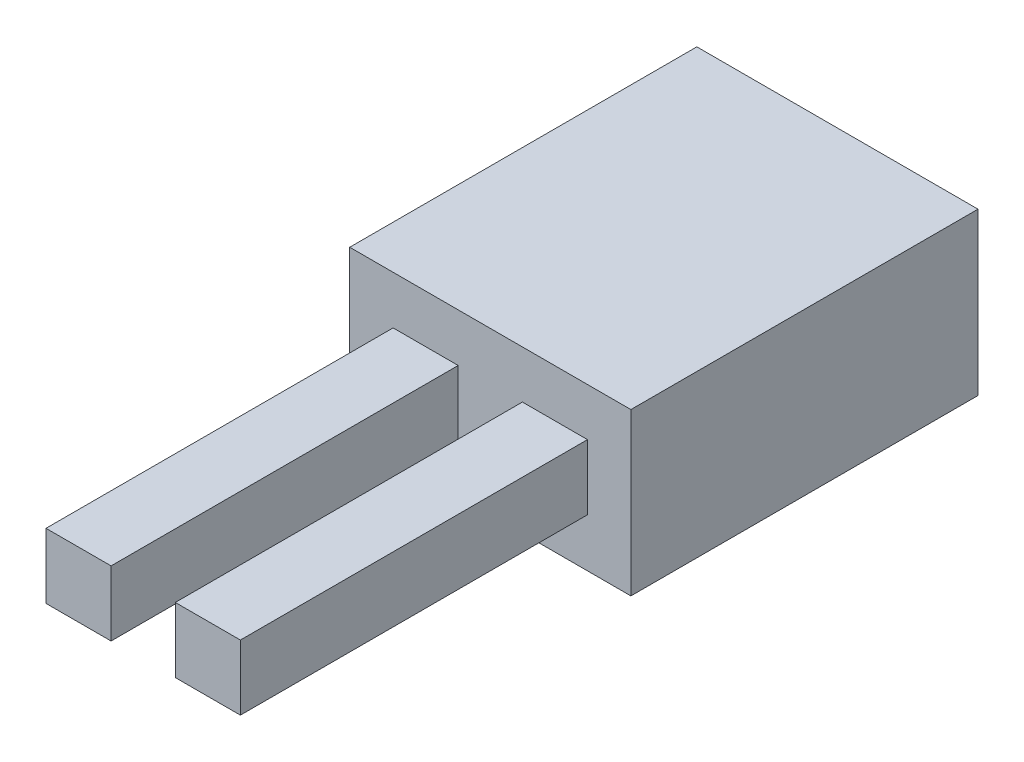
ISO-10303-21;
HEADER;
FILE_DESCRIPTION(('STEP AP214'),'2;1');
FILE_NAME('part.step','',(''),(''),'','','');
FILE_SCHEMA(('AUTOMOTIVE_DESIGN { 1 0 10303 214 1 1 1 1 }'));
ENDSEC;
DATA;
#1=APPLICATION_CONTEXT('core data for automotive mechanical design processes');
#2=APPLICATION_PROTOCOL_DEFINITION('international standard','automotive_design',2000,#1);
#3=PRODUCT_CONTEXT('',#1,'mechanical');
#4=PRODUCT('Part','Part','',(#3));
#5=PRODUCT_RELATED_PRODUCT_CATEGORY('part','',(#4));
#6=PRODUCT_DEFINITION_FORMATION('','',#4);
#7=PRODUCT_DEFINITION_CONTEXT('part definition',#1,'design');
#8=PRODUCT_DEFINITION('design','',#6,#7);
#9=PRODUCT_DEFINITION_SHAPE('','',#8);
#10=(LENGTH_UNIT() NAMED_UNIT(*) SI_UNIT(.MILLI.,.METRE.));
#11=(NAMED_UNIT(*) PLANE_ANGLE_UNIT() SI_UNIT($,.RADIAN.));
#12=(NAMED_UNIT(*) SI_UNIT($,.STERADIAN.) SOLID_ANGLE_UNIT());
#13=UNCERTAINTY_MEASURE_WITH_UNIT(LENGTH_MEASURE(1.E-05),#10,'distance_accuracy_value','');
#14=(GEOMETRIC_REPRESENTATION_CONTEXT(3) GLOBAL_UNCERTAINTY_ASSIGNED_CONTEXT((#13)) GLOBAL_UNIT_ASSIGNED_CONTEXT((#10,
#11,#12)) REPRESENTATION_CONTEXT('',''));
#15=CARTESIAN_POINT('',(0.,0.,0.));
#16=DIRECTION('',(0.,0.,1.));
#17=DIRECTION('',(1.,0.,0.));
#18=AXIS2_PLACEMENT_3D('',#15,#16,#17);
#19=CARTESIAN_POINT('',(0.,1.86,0.));
#20=DIRECTION('',(0.,0.,-1.));
#21=DIRECTION('',(-1.,0.,0.));
#22=AXIS2_PLACEMENT_3D('',#19,#20,#21);
#23=PLANE('',#22);
#24=DIRECTION('',(0.,-1.,0.));
#25=VECTOR('',#24,1.);
#26=CARTESIAN_POINT('',(0.5,1.305,0.));
#27=LINE('',#26,#25);
#28=CARTESIAN_POINT('',(0.5,1.305,0.));
#29=VERTEX_POINT('',#28);
#30=CARTESIAN_POINT('',(0.5,0.555,0.));
#31=VERTEX_POINT('',#30);
#32=EDGE_CURVE('E143',#29,#31,#27,.T.);
#33=ORIENTED_EDGE('',*,*,#32,.F.);
#34=DIRECTION('',(-1.,0.,0.));
#35=VECTOR('',#34,1.);
#36=CARTESIAN_POINT('',(0.5,1.305,0.));
#37=LINE('',#36,#35);
#38=CARTESIAN_POINT('',(1.25,1.305,0.));
#39=VERTEX_POINT('',#38);
#40=EDGE_CURVE('E156',#39,#29,#37,.T.);
#41=ORIENTED_EDGE('',*,*,#40,.F.);
#42=DIRECTION('',(0.,1.,0.));
#43=VECTOR('',#42,1.);
#44=CARTESIAN_POINT('',(1.25,1.305,0.));
#45=LINE('',#44,#43);
#46=CARTESIAN_POINT('',(1.25,0.555,0.));
#47=VERTEX_POINT('',#46);
#48=EDGE_CURVE('E165',#47,#39,#45,.T.);
#49=ORIENTED_EDGE('',*,*,#48,.F.);
#50=DIRECTION('',(1.,0.,0.));
#51=VECTOR('',#50,1.);
#52=CARTESIAN_POINT('',(0.5,0.555,0.));
#53=LINE('',#52,#51);
#54=EDGE_CURVE('E146',#31,#47,#53,.T.);
#55=ORIENTED_EDGE('',*,*,#54,.F.);
#56=EDGE_LOOP('',(#33,#41,#49,#55));
#57=FACE_BOUND('',#56,.T.);
#58=DIRECTION('',(1.,0.,0.));
#59=VECTOR('',#58,1.);
#60=CARTESIAN_POINT('',(0.,0.,0.));
#61=LINE('',#60,#59);
#62=CARTESIAN_POINT('',(0.,0.,0.));
#63=VERTEX_POINT('',#62);
#64=CARTESIAN_POINT('',(3.24,0.,0.));
#65=VERTEX_POINT('',#64);
#66=EDGE_CURVE('E195',#63,#65,#61,.T.);
#67=ORIENTED_EDGE('',*,*,#66,.T.);
#68=DIRECTION('',(0.,-1.,0.));
#69=VECTOR('',#68,1.);
#70=CARTESIAN_POINT('',(3.24,1.86,0.));
#71=LINE('',#70,#69);
#72=CARTESIAN_POINT('',(3.24,1.86,0.));
#73=VERTEX_POINT('',#72);
#74=EDGE_CURVE('E41',#73,#65,#71,.T.);
#75=ORIENTED_EDGE('',*,*,#74,.F.);
#76=DIRECTION('',(1.,0.,0.));
#77=VECTOR('',#76,1.);
#78=CARTESIAN_POINT('',(0.,1.86,0.));
#79=LINE('',#78,#77);
#80=CARTESIAN_POINT('',(0.,1.86,0.));
#81=VERTEX_POINT('',#80);
#82=EDGE_CURVE('E185',#81,#73,#79,.T.);
#83=ORIENTED_EDGE('',*,*,#82,.F.);
#84=DIRECTION('',(0.,-1.,0.));
#85=VECTOR('',#84,1.);
#86=CARTESIAN_POINT('',(0.,1.86,0.));
#87=LINE('',#86,#85);
#88=EDGE_CURVE('E11',#81,#63,#87,.T.);
#89=ORIENTED_EDGE('',*,*,#88,.T.);
#90=EDGE_LOOP('',(#67,#75,#83,#89));
#91=FACE_BOUND('',#90,.T.);
#92=DIRECTION('',(0.,-1.,0.));
#93=VECTOR('',#92,1.);
#94=CARTESIAN_POINT('',(1.99,1.31,0.));
#95=LINE('',#94,#93);
#96=CARTESIAN_POINT('',(1.99,1.31,0.));
#97=VERTEX_POINT('',#96);
#98=CARTESIAN_POINT('',(1.99,0.56,0.));
#99=VERTEX_POINT('',#98);
#100=EDGE_CURVE('E142',#97,#99,#95,.T.);
#101=ORIENTED_EDGE('',*,*,#100,.F.);
#102=DIRECTION('',(-1.,0.,0.));
#103=VECTOR('',#102,1.);
#104=CARTESIAN_POINT('',(1.99,1.31,0.));
#105=LINE('',#104,#103);
#106=CARTESIAN_POINT('',(2.74,1.31,0.));
#107=VERTEX_POINT('',#106);
#108=EDGE_CURVE('E139',#107,#97,#105,.T.);
#109=ORIENTED_EDGE('',*,*,#108,.F.);
#110=DIRECTION('',(0.,1.,0.));
#111=VECTOR('',#110,1.);
#112=CARTESIAN_POINT('',(2.74,1.31,0.));
#113=LINE('',#112,#111);
#114=CARTESIAN_POINT('',(2.74,0.56,0.));
#115=VERTEX_POINT('',#114);
#116=EDGE_CURVE('E53',#115,#107,#113,.T.);
#117=ORIENTED_EDGE('',*,*,#116,.F.);
#118=DIRECTION('',(1.,0.,0.));
#119=VECTOR('',#118,1.);
#120=CARTESIAN_POINT('',(1.99,0.56,0.));
#121=LINE('',#120,#119);
#122=EDGE_CURVE('E48',#99,#115,#121,.T.);
#123=ORIENTED_EDGE('',*,*,#122,.F.);
#124=EDGE_LOOP('',(#101,#109,#117,#123));
#125=FACE_BOUND('',#124,.T.);
#126=ADVANCED_FACE('F33',(#57,#91,#125),#23,.F.);
#127=CARTESIAN_POINT('',(0.,1.86,0.));
#128=DIRECTION('',(1.,0.,0.));
#129=DIRECTION('',(0.,0.,-1.));
#130=AXIS2_PLACEMENT_3D('',#127,#128,#129);
#131=PLANE('',#130);
#132=DIRECTION('',(0.,0.,1.));
#133=VECTOR('',#132,1.);
#134=CARTESIAN_POINT('',(0.,0.,0.));
#135=LINE('',#134,#133);
#136=CARTESIAN_POINT('',(0.,0.,-4.));
#137=VERTEX_POINT('',#136);
#138=EDGE_CURVE('E181',#137,#63,#135,.T.);
#139=ORIENTED_EDGE('',*,*,#138,.T.);
#140=ORIENTED_EDGE('',*,*,#88,.F.);
#141=DIRECTION('',(0.,0.,1.));
#142=VECTOR('',#141,1.);
#143=CARTESIAN_POINT('',(0.,1.86,0.));
#144=LINE('',#143,#142);
#145=CARTESIAN_POINT('',(0.,1.86,-4.));
#146=VERTEX_POINT('',#145);
#147=EDGE_CURVE('E182',#146,#81,#144,.T.);
#148=ORIENTED_EDGE('',*,*,#147,.F.);
#149=DIRECTION('',(0.,-1.,0.));
#150=VECTOR('',#149,1.);
#151=CARTESIAN_POINT('',(0.,1.86,-4.));
#152=LINE('',#151,#150);
#153=EDGE_CURVE('E192',#146,#137,#152,.T.);
#154=ORIENTED_EDGE('',*,*,#153,.T.);
#155=EDGE_LOOP('',(#139,#140,#148,#154));
#156=FACE_BOUND('',#155,.T.);
#157=ADVANCED_FACE('F35',(#156),#131,.F.);
#158=CARTESIAN_POINT('',(3.24,1.86,0.));
#159=DIRECTION('',(-1.,0.,0.));
#160=DIRECTION('',(0.,0.,1.));
#161=AXIS2_PLACEMENT_3D('',#158,#159,#160);
#162=PLANE('',#161);
#163=DIRECTION('',(0.,0.,-1.));
#164=VECTOR('',#163,1.);
#165=CARTESIAN_POINT('',(3.24,0.,0.));
#166=LINE('',#165,#164);
#167=CARTESIAN_POINT('',(3.24,0.,-4.));
#168=VERTEX_POINT('',#167);
#169=EDGE_CURVE('E197',#65,#168,#166,.T.);
#170=ORIENTED_EDGE('',*,*,#169,.T.);
#171=DIRECTION('',(0.,-1.,0.));
#172=VECTOR('',#171,1.);
#173=CARTESIAN_POINT('',(3.24,1.86,-4.));
#174=LINE('',#173,#172);
#175=CARTESIAN_POINT('',(3.24,1.86,-4.));
#176=VERTEX_POINT('',#175);
#177=EDGE_CURVE('E202',#176,#168,#174,.T.);
#178=ORIENTED_EDGE('',*,*,#177,.F.);
#179=DIRECTION('',(0.,0.,-1.));
#180=VECTOR('',#179,1.);
#181=CARTESIAN_POINT('',(3.24,1.86,0.));
#182=LINE('',#181,#180);
#183=EDGE_CURVE('E188',#73,#176,#182,.T.);
#184=ORIENTED_EDGE('',*,*,#183,.F.);
#185=ORIENTED_EDGE('',*,*,#74,.T.);
#186=EDGE_LOOP('',(#170,#178,#184,#185));
#187=FACE_BOUND('',#186,.T.);
#188=ADVANCED_FACE('F209',(#187),#162,.F.);
#189=CARTESIAN_POINT('',(0.,1.86,-4.));
#190=DIRECTION('',(0.,0.,1.));
#191=DIRECTION('',(1.,0.,0.));
#192=AXIS2_PLACEMENT_3D('',#189,#190,#191);
#193=PLANE('',#192);
#194=DIRECTION('',(-1.,0.,0.));
#195=VECTOR('',#194,1.);
#196=CARTESIAN_POINT('',(0.,0.,-4.));
#197=LINE('',#196,#195);
#198=EDGE_CURVE('E186',#168,#137,#197,.T.);
#199=ORIENTED_EDGE('',*,*,#198,.T.);
#200=ORIENTED_EDGE('',*,*,#153,.F.);
#201=DIRECTION('',(-1.,0.,0.));
#202=VECTOR('',#201,1.);
#203=CARTESIAN_POINT('',(0.,1.86,-4.));
#204=LINE('',#203,#202);
#205=EDGE_CURVE('E190',#176,#146,#204,.T.);
#206=ORIENTED_EDGE('',*,*,#205,.F.);
#207=ORIENTED_EDGE('',*,*,#177,.T.);
#208=EDGE_LOOP('',(#199,#200,#206,#207));
#209=FACE_BOUND('',#208,.T.);
#210=ADVANCED_FACE('F218',(#209),#193,.F.);
#211=CARTESIAN_POINT('',(0.,1.86,0.));
#212=DIRECTION('',(0.,-1.,0.));
#213=DIRECTION('',(0.,0.,-1.));
#214=AXIS2_PLACEMENT_3D('',#211,#212,#213);
#215=PLANE('',#214);
#216=ORIENTED_EDGE('',*,*,#147,.T.);
#217=ORIENTED_EDGE('',*,*,#82,.T.);
#218=ORIENTED_EDGE('',*,*,#183,.T.);
#219=ORIENTED_EDGE('',*,*,#205,.T.);
#220=EDGE_LOOP('',(#216,#217,#218,#219));
#221=FACE_BOUND('',#220,.T.);
#222=ADVANCED_FACE('F224',(#221),#215,.F.);
#223=CARTESIAN_POINT('',(0.,0.,0.));
#224=DIRECTION('',(0.,-1.,0.));
#225=DIRECTION('',(0.,0.,-1.));
#226=AXIS2_PLACEMENT_3D('',#223,#224,#225);
#227=PLANE('',#226);
#228=ORIENTED_EDGE('',*,*,#138,.F.);
#229=ORIENTED_EDGE('',*,*,#198,.F.);
#230=ORIENTED_EDGE('',*,*,#169,.F.);
#231=ORIENTED_EDGE('',*,*,#66,.F.);
#232=EDGE_LOOP('',(#228,#229,#230,#231));
#233=FACE_BOUND('',#232,.T.);
#234=ADVANCED_FACE('F215',(#233),#227,.T.);
#235=CARTESIAN_POINT('',(0.5,1.305,4.));
#236=DIRECTION('',(1.,0.,0.));
#237=DIRECTION('',(0.,1.,0.));
#238=AXIS2_PLACEMENT_3D('',#235,#236,#237);
#239=PLANE('',#238);
#240=ORIENTED_EDGE('',*,*,#32,.T.);
#241=DIRECTION('',(0.,0.,-1.));
#242=VECTOR('',#241,1.);
#243=CARTESIAN_POINT('',(0.5,0.555,4.));
#244=LINE('',#243,#242);
#245=CARTESIAN_POINT('',(0.5,0.555,4.));
#246=VERTEX_POINT('',#245);
#247=EDGE_CURVE('E178',#246,#31,#244,.T.);
#248=ORIENTED_EDGE('',*,*,#247,.F.);
#249=DIRECTION('',(0.,-1.,0.));
#250=VECTOR('',#249,1.);
#251=CARTESIAN_POINT('',(0.5,1.305,4.));
#252=LINE('',#251,#250);
#253=CARTESIAN_POINT('',(0.5,1.305,4.));
#254=VERTEX_POINT('',#253);
#255=EDGE_CURVE('E152',#254,#246,#252,.T.);
#256=ORIENTED_EDGE('',*,*,#255,.F.);
#257=DIRECTION('',(0.,0.,-1.));
#258=VECTOR('',#257,1.);
#259=CARTESIAN_POINT('',(0.5,1.305,4.));
#260=LINE('',#259,#258);
#261=EDGE_CURVE('E161',#254,#29,#260,.T.);
#262=ORIENTED_EDGE('',*,*,#261,.T.);
#263=EDGE_LOOP('',(#240,#248,#256,#262));
#264=FACE_BOUND('',#263,.T.);
#265=ADVANCED_FACE('F269',(#264),#239,.F.);
#266=CARTESIAN_POINT('',(0.5,0.555,4.));
#267=DIRECTION('',(0.,1.,0.));
#268=DIRECTION('',(0.,0.,1.));
#269=AXIS2_PLACEMENT_3D('',#266,#267,#268);
#270=PLANE('',#269);
#271=ORIENTED_EDGE('',*,*,#54,.T.);
#272=DIRECTION('',(0.,0.,-1.));
#273=VECTOR('',#272,1.);
#274=CARTESIAN_POINT('',(1.25,0.555,4.));
#275=LINE('',#274,#273);
#276=CARTESIAN_POINT('',(1.25,0.555,4.));
#277=VERTEX_POINT('',#276);
#278=EDGE_CURVE('E175',#277,#47,#275,.T.);
#279=ORIENTED_EDGE('',*,*,#278,.F.);
#280=DIRECTION('',(1.,0.,0.));
#281=VECTOR('',#280,1.);
#282=CARTESIAN_POINT('',(0.5,0.555,4.));
#283=LINE('',#282,#281);
#284=EDGE_CURVE('E155',#246,#277,#283,.T.);
#285=ORIENTED_EDGE('',*,*,#284,.F.);
#286=ORIENTED_EDGE('',*,*,#247,.T.);
#287=EDGE_LOOP('',(#271,#279,#285,#286));
#288=FACE_BOUND('',#287,.T.);
#289=ADVANCED_FACE('F265',(#288),#270,.F.);
#290=CARTESIAN_POINT('',(1.25,1.305,4.));
#291=DIRECTION('',(-1.,0.,0.));
#292=DIRECTION('',(0.,0.,1.));
#293=AXIS2_PLACEMENT_3D('',#290,#291,#292);
#294=PLANE('',#293);
#295=ORIENTED_EDGE('',*,*,#48,.T.);
#296=DIRECTION('',(0.,0.,-1.));
#297=VECTOR('',#296,1.);
#298=CARTESIAN_POINT('',(1.25,1.305,4.));
#299=LINE('',#298,#297);
#300=CARTESIAN_POINT('',(1.25,1.305,4.));
#301=VERTEX_POINT('',#300);
#302=EDGE_CURVE('E172',#301,#39,#299,.T.);
#303=ORIENTED_EDGE('',*,*,#302,.F.);
#304=DIRECTION('',(0.,1.,0.));
#305=VECTOR('',#304,1.);
#306=CARTESIAN_POINT('',(1.25,1.305,4.));
#307=LINE('',#306,#305);
#308=EDGE_CURVE('E158',#277,#301,#307,.T.);
#309=ORIENTED_EDGE('',*,*,#308,.F.);
#310=ORIENTED_EDGE('',*,*,#278,.T.);
#311=EDGE_LOOP('',(#295,#303,#309,#310));
#312=FACE_BOUND('',#311,.T.);
#313=ADVANCED_FACE('F261',(#312),#294,.F.);
#314=CARTESIAN_POINT('',(0.5,1.305,4.));
#315=DIRECTION('',(0.,-1.,0.));
#316=DIRECTION('',(0.,0.,-1.));
#317=AXIS2_PLACEMENT_3D('',#314,#315,#316);
#318=PLANE('',#317);
#319=ORIENTED_EDGE('',*,*,#40,.T.);
#320=ORIENTED_EDGE('',*,*,#261,.F.);
#321=DIRECTION('',(-1.,0.,0.));
#322=VECTOR('',#321,1.);
#323=CARTESIAN_POINT('',(0.5,1.305,4.));
#324=LINE('',#323,#322);
#325=EDGE_CURVE('E160',#301,#254,#324,.T.);
#326=ORIENTED_EDGE('',*,*,#325,.F.);
#327=ORIENTED_EDGE('',*,*,#302,.T.);
#328=EDGE_LOOP('',(#319,#320,#326,#327));
#329=FACE_BOUND('',#328,.T.);
#330=ADVANCED_FACE('F257',(#329),#318,.F.);
#331=CARTESIAN_POINT('',(0.,0.,4.));
#332=DIRECTION('',(0.,0.,1.));
#333=DIRECTION('',(1.,0.,0.));
#334=AXIS2_PLACEMENT_3D('',#331,#332,#333);
#335=PLANE('',#334);
#336=ORIENTED_EDGE('',*,*,#255,.T.);
#337=ORIENTED_EDGE('',*,*,#284,.T.);
#338=ORIENTED_EDGE('',*,*,#308,.T.);
#339=ORIENTED_EDGE('',*,*,#325,.T.);
#340=EDGE_LOOP('',(#336,#337,#338,#339));
#341=FACE_BOUND('',#340,.T.);
#342=ADVANCED_FACE('F254',(#341),#335,.T.);
#343=CARTESIAN_POINT('',(1.99,1.31,4.));
#344=DIRECTION('',(1.,0.,0.));
#345=DIRECTION('',(0.,0.,-1.));
#346=AXIS2_PLACEMENT_3D('',#343,#344,#345);
#347=PLANE('',#346);
#348=ORIENTED_EDGE('',*,*,#100,.T.);
#349=DIRECTION('',(0.,0.,-1.));
#350=VECTOR('',#349,1.);
#351=CARTESIAN_POINT('',(1.99,0.56,4.));
#352=LINE('',#351,#350);
#353=CARTESIAN_POINT('',(1.99,0.56,4.));
#354=VERTEX_POINT('',#353);
#355=EDGE_CURVE('E123',#354,#99,#352,.T.);
#356=ORIENTED_EDGE('',*,*,#355,.F.);
#357=DIRECTION('',(0.,-1.,0.));
#358=VECTOR('',#357,1.);
#359=CARTESIAN_POINT('',(1.99,1.31,4.));
#360=LINE('',#359,#358);
#361=CARTESIAN_POINT('',(1.99,1.31,4.));
#362=VERTEX_POINT('',#361);
#363=EDGE_CURVE('E130',#362,#354,#360,.T.);
#364=ORIENTED_EDGE('',*,*,#363,.F.);
#365=DIRECTION('',(0.,0.,-1.));
#366=VECTOR('',#365,1.);
#367=CARTESIAN_POINT('',(1.99,1.31,4.));
#368=LINE('',#367,#366);
#369=EDGE_CURVE('E232',#362,#97,#368,.T.);
#370=ORIENTED_EDGE('',*,*,#369,.T.);
#371=EDGE_LOOP('',(#348,#356,#364,#370));
#372=FACE_BOUND('',#371,.T.);
#373=ADVANCED_FACE('F141',(#372),#347,.F.);
#374=CARTESIAN_POINT('',(1.99,0.56,4.));
#375=DIRECTION('',(0.,1.,0.));
#376=DIRECTION('',(0.,0.,1.));
#377=AXIS2_PLACEMENT_3D('',#374,#375,#376);
#378=PLANE('',#377);
#379=ORIENTED_EDGE('',*,*,#122,.T.);
#380=DIRECTION('',(0.,0.,-1.));
#381=VECTOR('',#380,1.);
#382=CARTESIAN_POINT('',(2.74,0.56,4.));
#383=LINE('',#382,#381);
#384=CARTESIAN_POINT('',(2.74,0.56,4.));
#385=VERTEX_POINT('',#384);
#386=EDGE_CURVE('E126',#385,#115,#383,.T.);
#387=ORIENTED_EDGE('',*,*,#386,.F.);
#388=DIRECTION('',(1.,0.,0.));
#389=VECTOR('',#388,1.);
#390=CARTESIAN_POINT('',(1.99,0.56,4.));
#391=LINE('',#390,#389);
#392=EDGE_CURVE('E119',#354,#385,#391,.T.);
#393=ORIENTED_EDGE('',*,*,#392,.F.);
#394=ORIENTED_EDGE('',*,*,#355,.T.);
#395=EDGE_LOOP('',(#379,#387,#393,#394));
#396=FACE_BOUND('',#395,.T.);
#397=ADVANCED_FACE('F121',(#396),#378,.F.);
#398=CARTESIAN_POINT('',(2.74,1.31,4.));
#399=DIRECTION('',(-1.,0.,0.));
#400=DIRECTION('',(0.,0.,1.));
#401=AXIS2_PLACEMENT_3D('',#398,#399,#400);
#402=PLANE('',#401);
#403=ORIENTED_EDGE('',*,*,#116,.T.);
#404=DIRECTION('',(0.,0.,-1.));
#405=VECTOR('',#404,1.);
#406=CARTESIAN_POINT('',(2.74,1.31,4.));
#407=LINE('',#406,#405);
#408=CARTESIAN_POINT('',(2.74,1.31,4.));
#409=VERTEX_POINT('',#408);
#410=EDGE_CURVE('E148',#409,#107,#407,.T.);
#411=ORIENTED_EDGE('',*,*,#410,.F.);
#412=DIRECTION('',(0.,1.,0.));
#413=VECTOR('',#412,1.);
#414=CARTESIAN_POINT('',(2.74,1.31,4.));
#415=LINE('',#414,#413);
#416=EDGE_CURVE('E129',#385,#409,#415,.T.);
#417=ORIENTED_EDGE('',*,*,#416,.F.);
#418=ORIENTED_EDGE('',*,*,#386,.T.);
#419=EDGE_LOOP('',(#403,#411,#417,#418));
#420=FACE_BOUND('',#419,.T.);
#421=ADVANCED_FACE('F241',(#420),#402,.F.);
#422=CARTESIAN_POINT('',(1.99,1.31,4.));
#423=DIRECTION('',(0.,-1.,0.));
#424=DIRECTION('',(0.,0.,-1.));
#425=AXIS2_PLACEMENT_3D('',#422,#423,#424);
#426=PLANE('',#425);
#427=ORIENTED_EDGE('',*,*,#108,.T.);
#428=ORIENTED_EDGE('',*,*,#369,.F.);
#429=DIRECTION('',(-1.,0.,0.));
#430=VECTOR('',#429,1.);
#431=CARTESIAN_POINT('',(1.99,1.31,4.));
#432=LINE('',#431,#430);
#433=EDGE_CURVE('E135',#409,#362,#432,.T.);
#434=ORIENTED_EDGE('',*,*,#433,.F.);
#435=ORIENTED_EDGE('',*,*,#410,.T.);
#436=EDGE_LOOP('',(#427,#428,#434,#435));
#437=FACE_BOUND('',#436,.T.);
#438=ADVANCED_FACE('F231',(#437),#426,.F.);
#439=CARTESIAN_POINT('',(0.,0.,4.));
#440=DIRECTION('',(0.,0.,1.));
#441=DIRECTION('',(1.,0.,0.));
#442=AXIS2_PLACEMENT_3D('',#439,#440,#441);
#443=PLANE('',#442);
#444=ORIENTED_EDGE('',*,*,#363,.T.);
#445=ORIENTED_EDGE('',*,*,#392,.T.);
#446=ORIENTED_EDGE('',*,*,#416,.T.);
#447=ORIENTED_EDGE('',*,*,#433,.T.);
#448=EDGE_LOOP('',(#444,#445,#446,#447));
#449=FACE_BOUND('',#448,.T.);
#450=ADVANCED_FACE('F133',(#449),#443,.T.);
#451=CLOSED_SHELL('',(#126,#157,#188,#210,#222,#234,#265,#289,#313,#330,#342,#373,#397,#421,
#438,#450));
#452=MANIFOLD_SOLID_BREP('B2',#451);
#453=ADVANCED_BREP_SHAPE_REPRESENTATION('',(#18,#452),#14);
#454=SHAPE_DEFINITION_REPRESENTATION(#9,#453);
ENDSEC;
END-ISO-10303-21;
